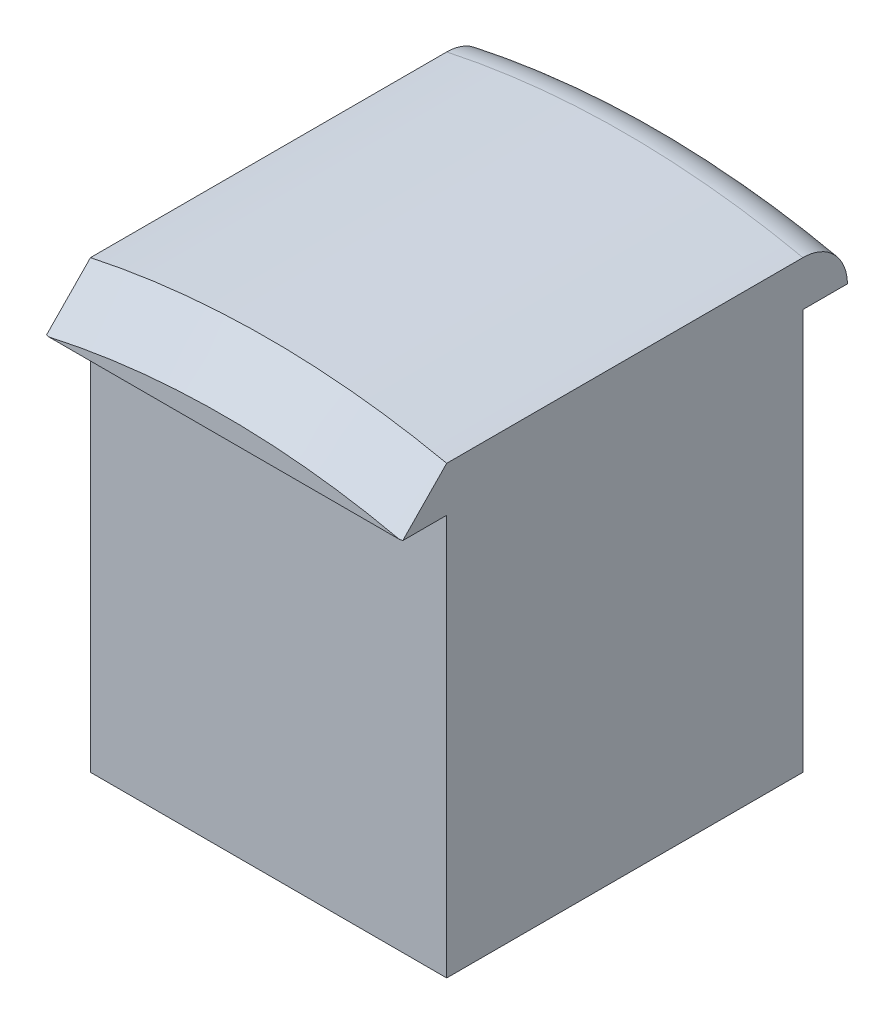
ISO-10303-21;
HEADER;
FILE_DESCRIPTION(('STEP AP214'),'2;1');
FILE_NAME('part.step','',(''),(''),'','','');
FILE_SCHEMA(('AUTOMOTIVE_DESIGN { 1 0 10303 214 1 1 1 1 }'));
ENDSEC;
DATA;
#1=APPLICATION_CONTEXT('core data for automotive mechanical design processes');
#2=APPLICATION_PROTOCOL_DEFINITION('international standard','automotive_design',2000,#1);
#3=PRODUCT_CONTEXT('',#1,'mechanical');
#4=PRODUCT('Part','Part','',(#3));
#5=PRODUCT_RELATED_PRODUCT_CATEGORY('part','',(#4));
#6=PRODUCT_DEFINITION_FORMATION('','',#4);
#7=PRODUCT_DEFINITION_CONTEXT('part definition',#1,'design');
#8=PRODUCT_DEFINITION('design','',#6,#7);
#9=PRODUCT_DEFINITION_SHAPE('','',#8);
#10=(LENGTH_UNIT() NAMED_UNIT(*) SI_UNIT(.MILLI.,.METRE.));
#11=(NAMED_UNIT(*) PLANE_ANGLE_UNIT() SI_UNIT($,.RADIAN.));
#12=(NAMED_UNIT(*) SI_UNIT($,.STERADIAN.) SOLID_ANGLE_UNIT());
#13=UNCERTAINTY_MEASURE_WITH_UNIT(LENGTH_MEASURE(1.E-05),#10,'distance_accuracy_value','');
#14=(GEOMETRIC_REPRESENTATION_CONTEXT(3) GLOBAL_UNCERTAINTY_ASSIGNED_CONTEXT((#13)) GLOBAL_UNIT_ASSIGNED_CONTEXT((#10,
#11,#12)) REPRESENTATION_CONTEXT('',''));
#15=CARTESIAN_POINT('',(0.,0.,0.));
#16=DIRECTION('',(0.,0.,1.));
#17=DIRECTION('',(1.,0.,0.));
#18=AXIS2_PLACEMENT_3D('',#15,#16,#17);
#19=CARTESIAN_POINT('',(-10.7945891997526,0.,50.));
#20=DIRECTION('',(-1.,0.,0.));
#21=DIRECTION('',(0.,-1.,0.));
#22=AXIS2_PLACEMENT_3D('',#19,#20,#21);
#23=PLANE('',#22);
#24=DIRECTION('',(0.,0.,-1.));
#25=VECTOR('',#24,1.);
#26=CARTESIAN_POINT('',(-10.7945891997528,126.897083669474,50.));
#27=LINE('',#26,#25);
#28=CARTESIAN_POINT('',(-10.7945891997528,126.897083669474,45.));
#29=VERTEX_POINT('',#28);
#30=CARTESIAN_POINT('',(-10.7945891997528,126.897083669474,5.));
#31=VERTEX_POINT('',#30);
#32=EDGE_CURVE('E262',#29,#31,#27,.T.);
#33=ORIENTED_EDGE('',*,*,#32,.F.);
#34=CARTESIAN_POINT('',(-10.7945891997528,126.897083669474,45.));
#35=CARTESIAN_POINT('',(-10.7945891997528,126.055807529842,45.8224501634708));
#36=CARTESIAN_POINT('',(-10.7945891997528,125.214262952471,46.6446253855792));
#37=CARTESIAN_POINT('',(-10.7945891997528,123.530636917463,48.2884259517434));
#38=CARTESIAN_POINT('',(-10.7945891997528,122.688555459823,49.1100512957961));
#39=CARTESIAN_POINT('',(-10.7945891997528,121.846205564441,49.9314016984832));
#40=B_SPLINE_CURVE_WITH_KNOTS('',3,(#34,#35,#36,#37,#38,#39),.UNSPECIFIED.,.F.,.F.,(4,2,4),(0.,
3.52952182936612,7.05904367879725),.UNSPECIFIED.);
#41=CARTESIAN_POINT('',(-10.7945891997528,121.846205564441,49.9314016984832));
#42=VERTEX_POINT('',#41);
#43=EDGE_CURVE('E11',#29,#42,#40,.T.);
#44=ORIENTED_EDGE('',*,*,#43,.T.);
#45=DIRECTION('',(0.,0.,-1.));
#46=VECTOR('',#45,1.);
#47=CARTESIAN_POINT('',(-10.7945891997528,121.846205564441,50.));
#48=LINE('',#47,#46);
#49=CARTESIAN_POINT('',(-10.7945891997528,121.846205564441,45.));
#50=VERTEX_POINT('',#49);
#51=EDGE_CURVE('E240',#42,#50,#48,.T.);
#52=ORIENTED_EDGE('',*,*,#51,.T.);
#53=DIRECTION('',(0.,-1.,0.));
#54=VECTOR('',#53,1.);
#55=CARTESIAN_POINT('',(-10.7945891997526,0.,45.));
#56=LINE('',#55,#54);
#57=CARTESIAN_POINT('',(-10.7945891997528,76.8462055644408,45.));
#58=VERTEX_POINT('',#57);
#59=EDGE_CURVE('E243',#50,#58,#56,.T.);
#60=ORIENTED_EDGE('',*,*,#59,.T.);
#61=DIRECTION('',(0.,0.,-1.));
#62=VECTOR('',#61,1.);
#63=CARTESIAN_POINT('',(-10.7945891997528,76.8462055644408,50.));
#64=LINE('',#63,#62);
#65=CARTESIAN_POINT('',(-10.7945891997528,76.8462055644408,5.));
#66=VERTEX_POINT('',#65);
#67=EDGE_CURVE('E251',#58,#66,#64,.T.);
#68=ORIENTED_EDGE('',*,*,#67,.T.);
#69=DIRECTION('',(0.,1.,0.));
#70=VECTOR('',#69,1.);
#71=CARTESIAN_POINT('',(-10.7945891997526,0.,4.99999999999999));
#72=LINE('',#71,#70);
#73=CARTESIAN_POINT('',(-10.7945891997528,121.846205564441,5.));
#74=VERTEX_POINT('',#73);
#75=EDGE_CURVE('E247',#66,#74,#72,.T.);
#76=ORIENTED_EDGE('',*,*,#75,.T.);
#77=DIRECTION('',(0.,0.,-1.));
#78=VECTOR('',#77,1.);
#79=CARTESIAN_POINT('',(-10.7945891997528,121.846205564441,50.));
#80=LINE('',#79,#78);
#81=CARTESIAN_POINT('',(-10.7945891997528,121.846205564441,0.000470594843045291));
#82=VERTEX_POINT('',#81);
#83=EDGE_CURVE('E221',#74,#82,#80,.T.);
#84=ORIENTED_EDGE('',*,*,#83,.T.);
#85=CARTESIAN_POINT('',(-10.7945891997528,121.846205564441,0.000470594843047893));
#86=CARTESIAN_POINT('',(-10.7945891997528,121.992824735912,0.0024188412525051));
#87=CARTESIAN_POINT('',(-10.7945891997528,122.139361629295,0.0105251535922447));
#88=CARTESIAN_POINT('',(-10.7945891997528,122.43124765879,0.0389568587041278));
#89=CARTESIAN_POINT('',(-10.7945891997528,122.576596774703,0.0592824588376017));
#90=CARTESIAN_POINT('',(-10.7945891997528,122.865085477981,0.112056800033256));
#91=CARTESIAN_POINT('',(-10.7945891997528,123.008224965854,0.144506085334534));
#92=CARTESIAN_POINT('',(-10.7945891997528,123.291263078148,0.221333749418445));
#93=CARTESIAN_POINT('',(-10.7945891997528,123.431161787298,0.265711815944265));
#94=CARTESIAN_POINT('',(-10.7945891997528,123.706799437564,0.366164479831264));
#95=CARTESIAN_POINT('',(-10.7945891997528,123.842535627021,0.422246630902108));
#96=CARTESIAN_POINT('',(-10.7945891997528,124.108802769342,0.545765306722473));
#97=CARTESIAN_POINT('',(-10.7945891997528,124.239331778248,0.613206023715186));
#98=CARTESIAN_POINT('',(-10.7945891997528,124.49405290906,0.758941401320211));
#99=CARTESIAN_POINT('',(-10.7945891997528,124.61824978702,0.837227746468492));
#100=CARTESIAN_POINT('',(-10.7945891997528,124.859503331531,1.00420915287417));
#101=CARTESIAN_POINT('',(-10.7945891997528,124.976557555855,1.09290774432922));
#102=CARTESIAN_POINT('',(-10.7945891997528,125.201049862749,1.27884051093464));
#103=CARTESIAN_POINT('',(-10.7945891997528,125.308595572458,1.37594473746499));
#104=CARTESIAN_POINT('',(-10.7945891997528,125.514957399316,1.57902284981379));
#105=CARTESIAN_POINT('',(-10.7945891997528,125.613773727637,1.6849965209517));
#106=CARTESIAN_POINT('',(-10.7945891997528,125.801929149279,1.90512374306443));
#107=CARTESIAN_POINT('',(-10.7945891997528,125.891264406327,2.01928057408187));
#108=CARTESIAN_POINT('',(-10.7945891997528,126.059652213162,2.25487846517246));
#109=CARTESIAN_POINT('',(-10.7945891997528,126.138708717498,2.37631669743847));
#110=CARTESIAN_POINT('',(-10.7945891997528,126.284267472185,2.62282765723561));
#111=CARTESIAN_POINT('',(-10.7945891997528,126.351011842945,2.74775746193798));
#112=CARTESIAN_POINT('',(-10.7945891997528,126.473522828507,3.00282887240682));
#113=CARTESIAN_POINT('',(-10.7945891997528,126.52929385437,3.13296835856585));
#114=CARTESIAN_POINT('',(-10.7945891997528,126.629401213092,3.3974797329412));
#115=CARTESIAN_POINT('',(-10.7945891997528,126.673744865963,3.53184884957099));
#116=CARTESIAN_POINT('',(-10.7945891997528,126.75066560474,3.80386316949725));
#117=CARTESIAN_POINT('',(-10.7945891997528,126.783246607586,3.941507265927));
#118=CARTESIAN_POINT('',(-10.7945891997528,126.838826536844,4.23187345591466));
#119=CARTESIAN_POINT('',(-10.7945891997528,126.860668975691,4.38481825071768));
#120=CARTESIAN_POINT('',(-10.7945891997528,126.889799903708,4.69184409044815));
#121=CARTESIAN_POINT('',(-10.7945891997528,126.897111198458,4.84592297338459));
#122=CARTESIAN_POINT('',(-10.7945891997528,126.897083669474,5.));
#123=B_SPLINE_CURVE_WITH_KNOTS('',3,(#85,#86,#87,#88,#89,#90,#91,#92,#93,#94,#95,#96,#97,#98,
#99,#100,#101,#102,#103,#104,#105,#106,#107,#108,#109,#110,#111,#112,#113,#114,#115,#116,#117,
#118,#119,#120,#121,#122),.UNSPECIFIED.,.F.,.F.,(4,2,2,2,2,2,2,2,2,2,2,2,2,2,2,2,2,2,4),(0.,
0.439768076604842,0.879543616285214,1.31933890011121,1.75912267264367,2.19919116026993,
2.63942242665717,3.0793180118194,3.51936317354784,3.95352604575094,4.38767841229299,
4.82200578311586,5.25616555743005,5.6805725578725,6.10480860522795,6.52877222114458,
6.95259452745413,7.41538592575939,7.87745043104916),.UNSPECIFIED.);
#124=EDGE_CURVE('E360',#82,#31,#123,.T.);
#125=ORIENTED_EDGE('',*,*,#124,.T.);
#126=EDGE_LOOP('',(#33,#44,#52,#60,#68,#76,#84,#125));
#127=FACE_BOUND('',#126,.T.);
#128=ADVANCED_FACE('F48',(#127),#23,.F.);
#129=CARTESIAN_POINT('',(-30.7945891997528,34.0262055644408,50.));
#130=DIRECTION('',(0.,0.,-1.));
#131=DIRECTION('',(-1.,0.,0.));
#132=AXIS2_PLACEMENT_3D('',#129,#130,#131);
#133=CYLINDRICAL_SURFACE('',#132,95.);
#134=DIRECTION('',(0.,0.,-1.));
#135=VECTOR('',#134,1.);
#136=CARTESIAN_POINT('',(-50.7945891997528,126.897083669474,50.));
#137=LINE('',#136,#135);
#138=CARTESIAN_POINT('',(-50.7945891997528,126.897083669474,45.));
#139=VERTEX_POINT('',#138);
#140=CARTESIAN_POINT('',(-50.7945891997528,126.897083669474,5.));
#141=VERTEX_POINT('',#140);
#142=EDGE_CURVE('E259',#139,#141,#137,.T.);
#143=ORIENTED_EDGE('',*,*,#142,.F.);
#144=CARTESIAN_POINT('',(-30.7945891997528,34.0262055644408,45.));
#145=DIRECTION('',(0.,0.,1.));
#146=DIRECTION('',(1.,0.,0.));
#147=AXIS2_PLACEMENT_3D('',#144,#145,#146);
#148=CIRCLE('',#147,95.);
#149=EDGE_CURVE('E64',#139,#29,#148,.F.);
#150=ORIENTED_EDGE('',*,*,#149,.T.);
#151=ORIENTED_EDGE('',*,*,#32,.T.);
#152=CARTESIAN_POINT('',(-30.7945891997528,34.0262055644408,5.));
#153=DIRECTION('',(0.,0.,1.));
#154=DIRECTION('',(1.,0.,0.));
#155=AXIS2_PLACEMENT_3D('',#152,#153,#154);
#156=CIRCLE('',#155,95.);
#157=EDGE_CURVE('E273',#31,#141,#156,.T.);
#158=ORIENTED_EDGE('',*,*,#157,.T.);
#159=EDGE_LOOP('',(#143,#150,#151,#158));
#160=FACE_BOUND('',#159,.T.);
#161=ADVANCED_FACE('F377',(#160),#133,.T.);
#162=CARTESIAN_POINT('',(-50.7945891997528,0.,50.));
#163=DIRECTION('',(-1.,0.,0.));
#164=DIRECTION('',(0.,0.,1.));
#165=AXIS2_PLACEMENT_3D('',#162,#163,#164);
#166=PLANE('',#165);
#167=DIRECTION('',(0.,0.,-1.));
#168=VECTOR('',#167,1.);
#169=CARTESIAN_POINT('',(-50.7945891997528,121.846205564441,50.));
#170=LINE('',#169,#168);
#171=CARTESIAN_POINT('',(-50.7945891997528,121.846205564441,49.9314016984832));
#172=VERTEX_POINT('',#171);
#173=CARTESIAN_POINT('',(-50.7945891997528,121.846205564441,45.));
#174=VERTEX_POINT('',#173);
#175=EDGE_CURVE('E212',#172,#174,#170,.T.);
#176=ORIENTED_EDGE('',*,*,#175,.F.);
#177=CARTESIAN_POINT('',(-50.7945891997528,121.846205564441,49.9314016984832));
#178=CARTESIAN_POINT('',(-50.7945891997528,122.688555459823,49.1100512957961));
#179=CARTESIAN_POINT('',(-50.7945891997528,123.530636917463,48.2884259517434));
#180=CARTESIAN_POINT('',(-50.7945891997528,125.214262952471,46.6446253855792));
#181=CARTESIAN_POINT('',(-50.7945891997528,126.055807529842,45.8224501634708));
#182=CARTESIAN_POINT('',(-50.7945891997528,126.897083669474,44.9999999999999));
#183=B_SPLINE_CURVE_WITH_KNOTS('',3,(#177,#178,#179,#180,#181,#182),.UNSPECIFIED.,.F.,.F.,(4,2,
4),(0.,3.52952184943114,7.05904367879725),.UNSPECIFIED.);
#184=EDGE_CURVE('E78',#172,#139,#183,.T.);
#185=ORIENTED_EDGE('',*,*,#184,.T.);
#186=ORIENTED_EDGE('',*,*,#142,.T.);
#187=CARTESIAN_POINT('',(-50.7945891997528,126.897083669474,5.));
#188=CARTESIAN_POINT('',(-50.7945891997528,126.897100640286,4.86169175819975));
#189=CARTESIAN_POINT('',(-50.7945891997528,126.891214086124,4.72338678120523));
#190=CARTESIAN_POINT('',(-50.7945891997528,126.867757157794,4.44778331834072));
#191=CARTESIAN_POINT('',(-50.7945891997528,126.850187844222,4.31048474225031));
#192=CARTESIAN_POINT('',(-50.7945891997528,126.803520177982,4.03805300206223));
#193=CARTESIAN_POINT('',(-50.7945891997528,126.77443745641,3.90291715947973));
#194=CARTESIAN_POINT('',(-50.7945891997528,126.704981088395,3.63558051347533));
#195=CARTESIAN_POINT('',(-50.7945891997528,126.664607487894,3.5033796981136));
#196=CARTESIAN_POINT('',(-50.7945891997528,126.572884793542,3.24283155121542));
#197=CARTESIAN_POINT('',(-50.7945891997528,126.521534843344,3.11448452123323));
#198=CARTESIAN_POINT('',(-50.7945891997528,126.408243617904,2.86249773611399));
#199=CARTESIAN_POINT('',(-50.7945891997528,126.346298438276,2.73885973688375));
#200=CARTESIAN_POINT('',(-50.7945891997528,126.212335945025,2.49723280267465));
#201=CARTESIAN_POINT('',(-50.7945891997528,126.140322669197,2.37924162838372));
#202=CARTESIAN_POINT('',(-50.7945891997528,125.986724657745,2.14960166702445));
#203=CARTESIAN_POINT('',(-50.7945891997528,125.905136366505,2.03795525902999));
#204=CARTESIAN_POINT('',(-50.7945891997528,125.732243345511,1.82080851950503));
#205=CARTESIAN_POINT('',(-50.7945891997528,125.640857710596,1.71537261116617));
#206=CARTESIAN_POINT('',(-50.7945891997528,125.449630730645,1.51239934321917));
#207=CARTESIAN_POINT('',(-50.7945891997528,125.349786272147,1.41486491799917));
#208=CARTESIAN_POINT('',(-50.7945891997528,125.142414895506,1.22836990853971));
#209=CARTESIAN_POINT('',(-50.7945891997528,125.0348890485,1.13940813293039));
#210=CARTESIAN_POINT('',(-50.7945891997528,124.812873014538,0.970563030582926));
#211=CARTESIAN_POINT('',(-50.7945891997528,124.69838032228,0.890682999649062));
#212=CARTESIAN_POINT('',(-50.7945891997528,124.460780745968,0.738931222829886));
#213=CARTESIAN_POINT('',(-50.7945891997528,124.337542951837,0.667264388396756));
#214=CARTESIAN_POINT('',(-50.7945891997528,124.085510341675,0.534347879199487));
#215=CARTESIAN_POINT('',(-50.7945891997528,123.956713212413,0.473102594243633));
#216=CARTESIAN_POINT('',(-50.7945891997528,123.694590584561,0.361464075216651));
#217=CARTESIAN_POINT('',(-50.7945891997528,123.561268005211,0.311063993642025));
#218=CARTESIAN_POINT('',(-50.7945891997528,123.290942011185,0.221353411181057));
#219=CARTESIAN_POINT('',(-50.7945891997528,123.153937995853,0.182044732128934));
#220=CARTESIAN_POINT('',(-50.7945891997528,122.824099773053,0.101852815239192));
#221=CARTESIAN_POINT('',(-50.7945891997528,122.629973610421,0.0661292009447267));
#222=CARTESIAN_POINT('',(-50.7945891997528,122.336964646439,0.0291006465087521));
#223=CARTESIAN_POINT('',(-50.7945891997528,122.239048242079,0.0195180297900804));
#224=CARTESIAN_POINT('',(-50.7945891997528,122.042843829177,0.00586197013069567));
#225=CARTESIAN_POINT('',(-50.7945891997528,121.944555867102,0.00178785975575687));
#226=CARTESIAN_POINT('',(-50.7945891997528,121.846205564441,0.000470594843047483));
#227=B_SPLINE_CURVE_WITH_KNOTS('',3,(#187,#188,#189,#190,#191,#192,#193,#194,#195,#196,#197,
#198,#199,#200,#201,#202,#203,#204,#205,#206,#207,#208,#209,#210,#211,#212,#213,#214,#215,#216,
#217,#218,#219,#220,#221,#222,#223,#224,#225,#226),.UNSPECIFIED.,.F.,.F.,(4,2,2,2,2,2,2,2,2,2,2,
2,2,2,2,2,2,2,2,4),(0.,0.41479470212833,0.829551753021807,1.24374763243906,1.65794182657772,
2.07216834691749,2.48654784162199,2.90076162421432,3.31512971191675,3.73323042184625,
4.15148569752226,4.56968276277667,4.98803111235585,5.41522033116822,5.8425890493338,
6.26968713618033,6.69685533585061,7.28757698418091,7.58260043714235,7.87758814059411),.UNSPECIFIED.);
#228=CARTESIAN_POINT('',(-50.7945891997528,121.846205564441,0.000470594843047893));
#229=VERTEX_POINT('',#228);
#230=EDGE_CURVE('E277',#141,#229,#227,.T.);
#231=ORIENTED_EDGE('',*,*,#230,.T.);
#232=DIRECTION('',(0.,0.,-1.));
#233=VECTOR('',#232,1.);
#234=CARTESIAN_POINT('',(-50.7945891997528,121.846205564441,0.));
#235=LINE('',#234,#233);
#236=CARTESIAN_POINT('',(-50.7945891997528,121.846205564441,5.));
#237=VERTEX_POINT('',#236);
#238=EDGE_CURVE('E211',#237,#229,#235,.T.);
#239=ORIENTED_EDGE('',*,*,#238,.F.);
#240=DIRECTION('',(0.,1.,0.));
#241=VECTOR('',#240,1.);
#242=CARTESIAN_POINT('',(-50.7945891997528,121.846205564441,5.));
#243=LINE('',#242,#241);
#244=CARTESIAN_POINT('',(-50.7945891997528,76.8462055644408,5.));
#245=VERTEX_POINT('',#244);
#246=EDGE_CURVE('E207',#245,#237,#243,.T.);
#247=ORIENTED_EDGE('',*,*,#246,.F.);
#248=DIRECTION('',(0.,0.,-1.));
#249=VECTOR('',#248,1.);
#250=CARTESIAN_POINT('',(-50.7945891997528,76.8462055644408,50.));
#251=LINE('',#250,#249);
#252=CARTESIAN_POINT('',(-50.7945891997528,76.8462055644408,45.));
#253=VERTEX_POINT('',#252);
#254=EDGE_CURVE('E255',#253,#245,#251,.T.);
#255=ORIENTED_EDGE('',*,*,#254,.F.);
#256=DIRECTION('',(0.,-1.,0.));
#257=VECTOR('',#256,1.);
#258=CARTESIAN_POINT('',(-50.7945891997528,121.846205564441,45.));
#259=LINE('',#258,#257);
#260=EDGE_CURVE('E229',#174,#253,#259,.T.);
#261=ORIENTED_EDGE('',*,*,#260,.F.);
#262=EDGE_LOOP('',(#176,#185,#186,#231,#239,#247,#255,#261));
#263=FACE_BOUND('',#262,.T.);
#264=ADVANCED_FACE('F292',(#263),#166,.T.);
#265=CARTESIAN_POINT('',(0.,76.8462055644408,50.));
#266=DIRECTION('',(0.,1.,0.));
#267=DIRECTION('',(0.,0.,1.));
#268=AXIS2_PLACEMENT_3D('',#265,#266,#267);
#269=PLANE('',#268);
#270=ORIENTED_EDGE('',*,*,#254,.T.);
#271=DIRECTION('',(-1.,0.,0.));
#272=VECTOR('',#271,1.);
#273=CARTESIAN_POINT('',(-0.794589199752775,76.8462055644408,5.));
#274=LINE('',#273,#272);
#275=EDGE_CURVE('E216',#66,#245,#274,.T.);
#276=ORIENTED_EDGE('',*,*,#275,.F.);
#277=ORIENTED_EDGE('',*,*,#67,.F.);
#278=DIRECTION('',(-1.,0.,0.));
#279=VECTOR('',#278,1.);
#280=CARTESIAN_POINT('',(-0.794589199752775,76.8462055644408,45.));
#281=LINE('',#280,#279);
#282=EDGE_CURVE('E200',#58,#253,#281,.T.);
#283=ORIENTED_EDGE('',*,*,#282,.T.);
#284=EDGE_LOOP('',(#270,#276,#277,#283));
#285=FACE_BOUND('',#284,.T.);
#286=ADVANCED_FACE('F390',(#285),#269,.F.);
#287=CARTESIAN_POINT('',(0.,0.,50.));
#288=DIRECTION('',(0.,0.,1.));
#289=DIRECTION('',(1.,0.,0.));
#290=AXIS2_PLACEMENT_3D('',#287,#288,#289);
#291=PLANE('',#290);
#292=DIRECTION('',(-1.,0.,0.));
#293=VECTOR('',#292,1.);
#294=CARTESIAN_POINT('',(0.,121.846205564441,50.));
#295=LINE('',#294,#293);
#296=CARTESIAN_POINT('',(-11.1058208279119,121.846205564441,50.));
#297=VERTEX_POINT('',#296);
#298=CARTESIAN_POINT('',(-50.4833575715936,121.846205564441,50.));
#299=VERTEX_POINT('',#298);
#300=EDGE_CURVE('E269',#297,#299,#295,.T.);
#301=ORIENTED_EDGE('',*,*,#300,.F.);
#302=CARTESIAN_POINT('',(-30.7945891997528,34.0262055644408,50.));
#303=DIRECTION('',(0.,0.,1.));
#304=DIRECTION('',(1.,0.,0.));
#305=AXIS2_PLACEMENT_3D('',#302,#303,#304);
#306=CIRCLE('',#305,90.);
#307=EDGE_CURVE('E357',#297,#299,#306,.T.);
#308=ORIENTED_EDGE('',*,*,#307,.T.);
#309=EDGE_LOOP('',(#301,#308));
#310=FACE_BOUND('',#309,.T.);
#311=ADVANCED_FACE('F384',(#310),#291,.T.);
#312=CARTESIAN_POINT('',(0.,0.,0.));
#313=DIRECTION('',(0.,0.,1.));
#314=DIRECTION('',(1.,0.,0.));
#315=AXIS2_PLACEMENT_3D('',#312,#313,#314);
#316=PLANE('',#315);
#317=DIRECTION('',(-1.,0.,0.));
#318=VECTOR('',#317,1.);
#319=CARTESIAN_POINT('',(0.,121.846205564441,0.));
#320=LINE('',#319,#318);
#321=CARTESIAN_POINT('',(-11.1058208279119,121.846205564441,0.));
#322=VERTEX_POINT('',#321);
#323=CARTESIAN_POINT('',(-50.4833575715936,121.846205564441,0.));
#324=VERTEX_POINT('',#323);
#325=EDGE_CURVE('E265',#322,#324,#320,.T.);
#326=ORIENTED_EDGE('',*,*,#325,.T.);
#327=CARTESIAN_POINT('',(-30.7945891997528,34.0262055644408,0.));
#328=DIRECTION('',(0.,0.,1.));
#329=DIRECTION('',(1.,0.,0.));
#330=AXIS2_PLACEMENT_3D('',#327,#328,#329);
#331=CIRCLE('',#330,90.);
#332=EDGE_CURVE('E312',#324,#322,#331,.F.);
#333=ORIENTED_EDGE('',*,*,#332,.T.);
#334=EDGE_LOOP('',(#326,#333));
#335=FACE_BOUND('',#334,.T.);
#336=ADVANCED_FACE('F325',(#335),#316,.F.);
#337=CARTESIAN_POINT('',(-0.794589199752775,121.846205564441,5.));
#338=DIRECTION('',(0.,0.,1.));
#339=DIRECTION('',(0.,-1.,0.));
#340=AXIS2_PLACEMENT_3D('',#337,#338,#339);
#341=PLANE('',#340);
#342=DIRECTION('',(-1.,0.,0.));
#343=VECTOR('',#342,1.);
#344=CARTESIAN_POINT('',(-12.7945891997528,78.8462055644408,5.));
#345=LINE('',#344,#343);
#346=CARTESIAN_POINT('',(-12.7945891997528,78.8462055644408,5.));
#347=VERTEX_POINT('',#346);
#348=CARTESIAN_POINT('',(-48.7945891997528,78.8462055644408,5.));
#349=VERTEX_POINT('',#348);
#350=EDGE_CURVE('E186',#347,#349,#345,.T.);
#351=ORIENTED_EDGE('',*,*,#350,.F.);
#352=DIRECTION('',(0.,-1.,0.));
#353=VECTOR('',#352,1.);
#354=CARTESIAN_POINT('',(-12.7945891997528,121.846205564441,5.));
#355=LINE('',#354,#353);
#356=CARTESIAN_POINT('',(-12.7945891997528,121.846205564441,5.));
#357=VERTEX_POINT('',#356);
#358=EDGE_CURVE('E163',#357,#347,#355,.T.);
#359=ORIENTED_EDGE('',*,*,#358,.F.);
#360=DIRECTION('',(-1.,0.,0.));
#361=VECTOR('',#360,1.);
#362=CARTESIAN_POINT('',(-0.794589199752775,121.846205564441,5.));
#363=LINE('',#362,#361);
#364=EDGE_CURVE('E217',#74,#357,#363,.T.);
#365=ORIENTED_EDGE('',*,*,#364,.F.);
#366=ORIENTED_EDGE('',*,*,#75,.F.);
#367=ORIENTED_EDGE('',*,*,#275,.T.);
#368=ORIENTED_EDGE('',*,*,#246,.T.);
#369=CARTESIAN_POINT('',(-48.7945891997528,121.846205564441,5.));
#370=VERTEX_POINT('',#369);
#371=EDGE_CURVE('E222',#370,#237,#363,.T.);
#372=ORIENTED_EDGE('',*,*,#371,.F.);
#373=DIRECTION('',(0.,1.,0.));
#374=VECTOR('',#373,1.);
#375=CARTESIAN_POINT('',(-48.7945891997528,121.846205564441,5.));
#376=LINE('',#375,#374);
#377=EDGE_CURVE('E183',#349,#370,#376,.T.);
#378=ORIENTED_EDGE('',*,*,#377,.F.);
#379=EDGE_LOOP('',(#351,#359,#365,#366,#367,#368,#372,#378));
#380=FACE_BOUND('',#379,.T.);
#381=ADVANCED_FACE('F319',(#380),#341,.F.);
#382=CARTESIAN_POINT('',(-0.794589199752775,121.846205564441,0.));
#383=DIRECTION('',(0.,1.,0.));
#384=DIRECTION('',(0.,0.,1.));
#385=AXIS2_PLACEMENT_3D('',#382,#383,#384);
#386=PLANE('',#385);
#387=ORIENTED_EDGE('',*,*,#238,.T.);
#388=CARTESIAN_POINT('',(-50.7945891997528,121.846205564441,0.000470594843047893));
#389=CARTESIAN_POINT('',(-50.7427173809836,121.846205564441,0.00031314323827988));
#390=CARTESIAN_POINT('',(-50.6908455024744,121.846205564441,0.000195201198976292));
#391=CARTESIAN_POINT('',(-50.5871016264213,121.846205564441,3.83362519716448E-05));
#392=CARTESIAN_POINT('',(-50.5352296288775,121.846205564441,-5.86656408130379E-07));
#393=CARTESIAN_POINT('',(-50.4833575715936,121.846205564441,0.));
#394=B_SPLINE_CURVE_WITH_KNOTS('',3,(#388,#389,#390,#391,#392,#393),.UNSPECIFIED.,.F.,.F.,(4,2,
4),(0.,0.155616037777637,0.311232074218648),.UNSPECIFIED.);
#395=EDGE_CURVE('E305',#229,#324,#394,.T.);
#396=ORIENTED_EDGE('',*,*,#395,.T.);
#397=ORIENTED_EDGE('',*,*,#325,.F.);
#398=CARTESIAN_POINT('',(-11.1058208279119,121.846205564441,0.));
#399=CARTESIAN_POINT('',(-11.053948770628,121.846205564441,-5.86656406899319E-07));
#400=CARTESIAN_POINT('',(-11.0020767730842,121.846205564441,3.83362519722015E-05));
#401=CARTESIAN_POINT('',(-10.8983328970312,121.846205564441,0.000195201198976079));
#402=CARTESIAN_POINT('',(-10.8464610185219,121.846205564441,0.000313143238279571));
#403=CARTESIAN_POINT('',(-10.7945891997528,121.846205564441,0.000470594843047777));
#404=B_SPLINE_CURVE_WITH_KNOTS('',3,(#398,#399,#400,#401,#402,#403),.UNSPECIFIED.,.F.,.F.,(4,2,
4),(0.,0.155616036441001,0.311232074218626),.UNSPECIFIED.);
#405=EDGE_CURVE('E285',#322,#82,#404,.T.);
#406=ORIENTED_EDGE('',*,*,#405,.T.);
#407=ORIENTED_EDGE('',*,*,#83,.F.);
#408=ORIENTED_EDGE('',*,*,#364,.T.);
#409=DIRECTION('',(0.,0.,-1.));
#410=VECTOR('',#409,1.);
#411=CARTESIAN_POINT('',(-12.7945891997528,121.846205564441,43.));
#412=LINE('',#411,#410);
#413=CARTESIAN_POINT('',(-12.7945891997528,121.846205564441,43.));
#414=VERTEX_POINT('',#413);
#415=EDGE_CURVE('E197',#414,#357,#412,.T.);
#416=ORIENTED_EDGE('',*,*,#415,.F.);
#417=DIRECTION('',(1.,0.,0.));
#418=VECTOR('',#417,1.);
#419=CARTESIAN_POINT('',(-12.7945891997528,121.846205564441,43.));
#420=LINE('',#419,#418);
#421=CARTESIAN_POINT('',(-48.7945891997528,121.846205564441,43.));
#422=VERTEX_POINT('',#421);
#423=EDGE_CURVE('E169',#422,#414,#420,.T.);
#424=ORIENTED_EDGE('',*,*,#423,.F.);
#425=DIRECTION('',(0.,0.,-1.));
#426=VECTOR('',#425,1.);
#427=CARTESIAN_POINT('',(-48.7945891997528,121.846205564441,43.));
#428=LINE('',#427,#426);
#429=EDGE_CURVE('E201',#422,#370,#428,.T.);
#430=ORIENTED_EDGE('',*,*,#429,.T.);
#431=ORIENTED_EDGE('',*,*,#371,.T.);
#432=EDGE_LOOP('',(#387,#396,#397,#406,#407,#408,#416,#424,#430,#431));
#433=FACE_BOUND('',#432,.T.);
#434=ADVANCED_FACE('F313',(#433),#386,.F.);
#435=CARTESIAN_POINT('',(-0.794589199752775,121.846205564441,45.));
#436=DIRECTION('',(0.,0.,-1.));
#437=DIRECTION('',(0.,1.,0.));
#438=AXIS2_PLACEMENT_3D('',#435,#436,#437);
#439=PLANE('',#438);
#440=DIRECTION('',(-1.,0.,0.));
#441=VECTOR('',#440,1.);
#442=CARTESIAN_POINT('',(-0.794589199752775,121.846205564441,45.));
#443=LINE('',#442,#441);
#444=EDGE_CURVE('E225',#50,#174,#443,.T.);
#445=ORIENTED_EDGE('',*,*,#444,.T.);
#446=ORIENTED_EDGE('',*,*,#260,.T.);
#447=ORIENTED_EDGE('',*,*,#282,.F.);
#448=ORIENTED_EDGE('',*,*,#59,.F.);
#449=EDGE_LOOP('',(#445,#446,#447,#448));
#450=FACE_BOUND('',#449,.T.);
#451=ADVANCED_FACE('F318',(#450),#439,.F.);
#452=CARTESIAN_POINT('',(-0.794589199752775,121.846205564441,50.));
#453=DIRECTION('',(0.,1.,0.));
#454=DIRECTION('',(0.,0.,1.));
#455=AXIS2_PLACEMENT_3D('',#452,#453,#454);
#456=PLANE('',#455);
#457=ORIENTED_EDGE('',*,*,#300,.T.);
#458=CARTESIAN_POINT('',(-50.4833575715936,121.846205564441,50.));
#459=CARTESIAN_POINT('',(-50.5352474395654,121.846205564441,49.9886482981472));
#460=CARTESIAN_POINT('',(-50.5871283425706,121.846205564441,49.9772559220931));
#461=CARTESIAN_POINT('',(-50.6908722186236,121.846205564441,49.9543898215874));
#462=CARTESIAN_POINT('',(-50.7427351916714,121.846205564441,49.942916097136));
#463=CARTESIAN_POINT('',(-50.7945891997528,121.846205564441,49.9314016984832));
#464=B_SPLINE_CURVE_WITH_KNOTS('',3,(#458,#459,#460,#461,#462,#463),.UNSPECIFIED.,.F.,.F.,(4,2,
4),(0.,0.159350961588398,0.31870192310213),.UNSPECIFIED.);
#465=EDGE_CURVE('E342',#299,#172,#464,.T.);
#466=ORIENTED_EDGE('',*,*,#465,.T.);
#467=ORIENTED_EDGE('',*,*,#175,.T.);
#468=ORIENTED_EDGE('',*,*,#444,.F.);
#469=ORIENTED_EDGE('',*,*,#51,.F.);
#470=CARTESIAN_POINT('',(-10.7945891997528,121.846205564441,49.9314016984832));
#471=CARTESIAN_POINT('',(-10.8464432078341,121.846205564441,49.942916097136));
#472=CARTESIAN_POINT('',(-10.898306180882,121.846205564441,49.9543898215874));
#473=CARTESIAN_POINT('',(-11.002050056935,121.846205564441,49.9772559220931));
#474=CARTESIAN_POINT('',(-11.0539309599402,121.846205564441,49.9886482981472));
#475=CARTESIAN_POINT('',(-11.1058208279119,121.846205564441,50.));
#476=B_SPLINE_CURVE_WITH_KNOTS('',3,(#470,#471,#472,#473,#474,#475),.UNSPECIFIED.,.F.,.F.,(4,2,
4),(0.,0.159350961513735,0.318701923102119),.UNSPECIFIED.);
#477=EDGE_CURVE('E335',#42,#297,#476,.T.);
#478=ORIENTED_EDGE('',*,*,#477,.T.);
#479=EDGE_LOOP('',(#457,#466,#467,#468,#469,#478));
#480=FACE_BOUND('',#479,.T.);
#481=ADVANCED_FACE('F327',(#480),#456,.F.);
#482=CARTESIAN_POINT('',(-12.7945891997528,121.846205564441,43.));
#483=DIRECTION('',(1.,0.,0.));
#484=DIRECTION('',(0.,1.,0.));
#485=AXIS2_PLACEMENT_3D('',#482,#483,#484);
#486=PLANE('',#485);
#487=ORIENTED_EDGE('',*,*,#358,.T.);
#488=DIRECTION('',(0.,0.,-1.));
#489=VECTOR('',#488,1.);
#490=CARTESIAN_POINT('',(-12.7945891997528,78.8462055644408,43.));
#491=LINE('',#490,#489);
#492=CARTESIAN_POINT('',(-12.7945891997528,78.8462055644408,43.));
#493=VERTEX_POINT('',#492);
#494=EDGE_CURVE('E156',#493,#347,#491,.T.);
#495=ORIENTED_EDGE('',*,*,#494,.F.);
#496=DIRECTION('',(0.,-1.,0.));
#497=VECTOR('',#496,1.);
#498=CARTESIAN_POINT('',(-12.7945891997528,121.846205564441,43.));
#499=LINE('',#498,#497);
#500=EDGE_CURVE('E160',#414,#493,#499,.T.);
#501=ORIENTED_EDGE('',*,*,#500,.F.);
#502=ORIENTED_EDGE('',*,*,#415,.T.);
#503=EDGE_LOOP('',(#487,#495,#501,#502));
#504=FACE_BOUND('',#503,.T.);
#505=ADVANCED_FACE('F158',(#504),#486,.F.);
#506=CARTESIAN_POINT('',(-48.7945891997528,121.846205564441,43.));
#507=DIRECTION('',(-1.,0.,0.));
#508=DIRECTION('',(0.,-1.,0.));
#509=AXIS2_PLACEMENT_3D('',#506,#507,#508);
#510=PLANE('',#509);
#511=ORIENTED_EDGE('',*,*,#377,.T.);
#512=ORIENTED_EDGE('',*,*,#429,.F.);
#513=DIRECTION('',(0.,1.,0.));
#514=VECTOR('',#513,1.);
#515=CARTESIAN_POINT('',(-48.7945891997528,121.846205564441,43.));
#516=LINE('',#515,#514);
#517=CARTESIAN_POINT('',(-48.7945891997528,78.8462055644408,43.));
#518=VERTEX_POINT('',#517);
#519=EDGE_CURVE('E178',#518,#422,#516,.T.);
#520=ORIENTED_EDGE('',*,*,#519,.F.);
#521=DIRECTION('',(0.,0.,-1.));
#522=VECTOR('',#521,1.);
#523=CARTESIAN_POINT('',(-48.7945891997528,78.8462055644408,43.));
#524=LINE('',#523,#522);
#525=EDGE_CURVE('E168',#518,#349,#524,.T.);
#526=ORIENTED_EDGE('',*,*,#525,.T.);
#527=EDGE_LOOP('',(#511,#512,#520,#526));
#528=FACE_BOUND('',#527,.T.);
#529=ADVANCED_FACE('F417',(#528),#510,.F.);
#530=CARTESIAN_POINT('',(-12.7945891997528,78.8462055644408,43.));
#531=DIRECTION('',(0.,-1.,0.));
#532=DIRECTION('',(0.,0.,-1.));
#533=AXIS2_PLACEMENT_3D('',#530,#531,#532);
#534=PLANE('',#533);
#535=ORIENTED_EDGE('',*,*,#350,.T.);
#536=ORIENTED_EDGE('',*,*,#525,.F.);
#537=DIRECTION('',(-1.,0.,0.));
#538=VECTOR('',#537,1.);
#539=CARTESIAN_POINT('',(-12.7945891997528,78.8462055644408,43.));
#540=LINE('',#539,#538);
#541=EDGE_CURVE('E172',#493,#518,#540,.T.);
#542=ORIENTED_EDGE('',*,*,#541,.F.);
#543=ORIENTED_EDGE('',*,*,#494,.T.);
#544=EDGE_LOOP('',(#535,#536,#542,#543));
#545=FACE_BOUND('',#544,.T.);
#546=ADVANCED_FACE('F173',(#545),#534,.F.);
#547=CARTESIAN_POINT('',(0.,0.,43.));
#548=DIRECTION('',(0.,0.,-1.));
#549=DIRECTION('',(0.,1.,0.));
#550=AXIS2_PLACEMENT_3D('',#547,#548,#549);
#551=PLANE('',#550);
#552=ORIENTED_EDGE('',*,*,#500,.T.);
#553=ORIENTED_EDGE('',*,*,#541,.T.);
#554=ORIENTED_EDGE('',*,*,#519,.T.);
#555=ORIENTED_EDGE('',*,*,#423,.T.);
#556=EDGE_LOOP('',(#552,#553,#554,#555));
#557=FACE_BOUND('',#556,.T.);
#558=ADVANCED_FACE('F180',(#557),#551,.T.);
#559=CARTESIAN_POINT('',(-30.7945891997528,34.0262055644408,5.));
#560=DIRECTION('',(0.,0.,1.));
#561=DIRECTION('',(1.,0.,0.));
#562=AXIS2_PLACEMENT_3D('',#559,#560,#561);
#563=TOROIDAL_SURFACE('',#562,90.,5.);
#564=ORIENTED_EDGE('',*,*,#405,.F.);
#565=ORIENTED_EDGE('',*,*,#332,.F.);
#566=ORIENTED_EDGE('',*,*,#395,.F.);
#567=ORIENTED_EDGE('',*,*,#230,.F.);
#568=ORIENTED_EDGE('',*,*,#157,.F.);
#569=ORIENTED_EDGE('',*,*,#124,.F.);
#570=EDGE_LOOP('',(#564,#565,#566,#567,#568,#569));
#571=FACE_BOUND('',#570,.T.);
#572=ADVANCED_FACE('F296',(#571),#563,.T.);
#573=CARTESIAN_POINT('',(-30.7945891997528,34.0262055644408,50.));
#574=DIRECTION('',(0.,0.,-1.));
#575=DIRECTION('',(-1.,0.,0.));
#576=AXIS2_PLACEMENT_3D('',#573,#574,#575);
#577=CONICAL_SURFACE('',#576,90.,0.785398163397443);
#578=ORIENTED_EDGE('',*,*,#43,.F.);
#579=ORIENTED_EDGE('',*,*,#149,.F.);
#580=ORIENTED_EDGE('',*,*,#184,.F.);
#581=ORIENTED_EDGE('',*,*,#465,.F.);
#582=ORIENTED_EDGE('',*,*,#307,.F.);
#583=ORIENTED_EDGE('',*,*,#477,.F.);
#584=EDGE_LOOP('',(#578,#579,#580,#581,#582,#583));
#585=FACE_BOUND('',#584,.T.);
#586=ADVANCED_FACE('F51',(#585),#577,.T.);
#587=CLOSED_SHELL('',(#128,#161,#264,#286,#311,#336,#381,#434,#451,#481,#505,#529,#546,#558,
#572,#586));
#588=MANIFOLD_SOLID_BREP('B2',#587);
#589=ADVANCED_BREP_SHAPE_REPRESENTATION('',(#18,#588),#14);
#590=SHAPE_DEFINITION_REPRESENTATION(#9,#589);
ENDSEC;
END-ISO-10303-21;
